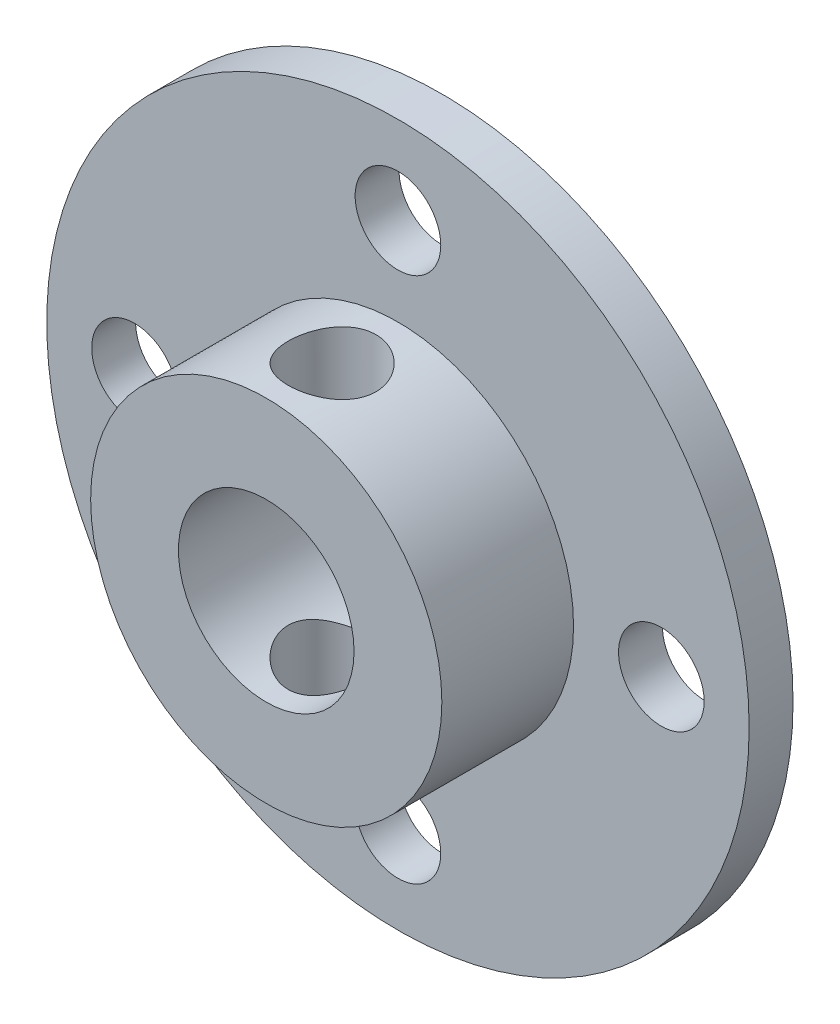
ISO-10303-21;
HEADER;
FILE_DESCRIPTION(('STEP AP214'),'2;1');
FILE_NAME('part.step','',(''),(''),'','','');
FILE_SCHEMA(('AUTOMOTIVE_DESIGN { 1 0 10303 214 1 1 1 1 }'));
ENDSEC;
DATA;
#1=APPLICATION_CONTEXT('core data for automotive mechanical design processes');
#2=APPLICATION_PROTOCOL_DEFINITION('international standard','automotive_design',2000,#1);
#3=PRODUCT_CONTEXT('',#1,'mechanical');
#4=PRODUCT('Part','Part','',(#3));
#5=PRODUCT_RELATED_PRODUCT_CATEGORY('part','',(#4));
#6=PRODUCT_DEFINITION_FORMATION('','',#4);
#7=PRODUCT_DEFINITION_CONTEXT('part definition',#1,'design');
#8=PRODUCT_DEFINITION('design','',#6,#7);
#9=PRODUCT_DEFINITION_SHAPE('','',#8);
#10=(LENGTH_UNIT() NAMED_UNIT(*) SI_UNIT(.MILLI.,.METRE.));
#11=(NAMED_UNIT(*) PLANE_ANGLE_UNIT() SI_UNIT($,.RADIAN.));
#12=(NAMED_UNIT(*) SI_UNIT($,.STERADIAN.) SOLID_ANGLE_UNIT());
#13=UNCERTAINTY_MEASURE_WITH_UNIT(LENGTH_MEASURE(1.E-05),#10,'distance_accuracy_value','');
#14=(GEOMETRIC_REPRESENTATION_CONTEXT(3) GLOBAL_UNCERTAINTY_ASSIGNED_CONTEXT((#13)) GLOBAL_UNIT_ASSIGNED_CONTEXT((#10,
#11,#12)) REPRESENTATION_CONTEXT('',''));
#15=CARTESIAN_POINT('',(0.,0.,0.));
#16=DIRECTION('',(0.,0.,1.));
#17=DIRECTION('',(1.,0.,0.));
#18=AXIS2_PLACEMENT_3D('',#15,#16,#17);
#19=CARTESIAN_POINT('',(0.,0.,8.));
#20=DIRECTION('',(0.,0.,1.));
#21=DIRECTION('',(1.,0.,0.));
#22=AXIS2_PLACEMENT_3D('',#19,#20,#21);
#23=PLANE('',#22);
#24=CARTESIAN_POINT('',(0.,0.,8.));
#25=DIRECTION('',(0.,0.,1.));
#26=DIRECTION('',(1.,0.,0.));
#27=AXIS2_PLACEMENT_3D('',#24,#25,#26);
#28=CIRCLE('',#27,8.);
#29=CARTESIAN_POINT('',(8.,0.,8.));
#30=VERTEX_POINT('',#29);
#31=EDGE_CURVE('E56',#30,#30,#28,.T.);
#32=ORIENTED_EDGE('',*,*,#31,.T.);
#33=EDGE_LOOP('',(#32));
#34=FACE_BOUND('',#33,.T.);
#35=CARTESIAN_POINT('',(0.,0.,8.));
#36=DIRECTION('',(0.,0.,1.));
#37=DIRECTION('',(1.,0.,0.));
#38=AXIS2_PLACEMENT_3D('',#35,#36,#37);
#39=CIRCLE('',#38,4.);
#40=CARTESIAN_POINT('',(4.,0.,8.));
#41=VERTEX_POINT('',#40);
#42=EDGE_CURVE('E62',#41,#41,#39,.T.);
#43=ORIENTED_EDGE('',*,*,#42,.F.);
#44=EDGE_LOOP('',(#43));
#45=FACE_BOUND('',#44,.T.);
#46=ADVANCED_FACE('F41',(#34,#45),#23,.T.);
#47=CARTESIAN_POINT('',(0.,0.,8.));
#48=DIRECTION('',(0.,0.,-1.));
#49=DIRECTION('',(-1.,0.,0.));
#50=AXIS2_PLACEMENT_3D('',#47,#48,#49);
#51=CYLINDRICAL_SURFACE('',#50,8.);
#52=CARTESIAN_POINT('',(0.,-8.,7.));
#53=CARTESIAN_POINT('',(0.110501451559642,-7.9999981315735,6.99999689901579));
#54=CARTESIAN_POINT('',(0.221037543774351,-7.99768770842435,6.99081126563495));
#55=CARTESIAN_POINT('',(0.438941765027377,-7.98869485106526,6.95436646492399));
#56=CARTESIAN_POINT('',(0.546308062494319,-7.98200993893301,6.92709705394953));
#57=CARTESIAN_POINT('',(0.754694496243435,-7.96500835109376,6.85541432871722));
#58=CARTESIAN_POINT('',(0.855722084573336,-7.95469603789411,6.81102160171297));
#59=CARTESIAN_POINT('',(1.04889617587257,-7.93153791743495,6.70642481327354));
#60=CARTESIAN_POINT('',(1.14104237913168,-7.91869202472209,6.64622021850804));
#61=CARTESIAN_POINT('',(1.31573590306789,-7.89156551455591,6.51039894712776));
#62=CARTESIAN_POINT('',(1.39807425341474,-7.87726276197502,6.43451790005459));
#63=CARTESIAN_POINT('',(1.54899856960443,-7.84898160157248,6.27006372678795));
#64=CARTESIAN_POINT('',(1.61758298259892,-7.83500323053157,6.18148916940409));
#65=CARTESIAN_POINT('',(1.74003539039863,-7.80873034264225,5.99253969768401));
#66=CARTESIAN_POINT('',(1.79366962123352,-7.79646392619748,5.89200902558836));
#67=CARTESIAN_POINT('',(1.88319587806766,-7.77532659757355,5.68300211778662));
#68=CARTESIAN_POINT('',(1.91909074058685,-7.76645514259224,5.57452715555731));
#69=CARTESIAN_POINT('',(1.97140644907302,-7.7533396892843,5.35500866906445));
#70=CARTESIAN_POINT('',(1.98820302444274,-7.74900654662681,5.24406013861601));
#71=CARTESIAN_POINT('',(2.00301570008855,-7.74519149946122,5.02084190800087));
#72=CARTESIAN_POINT('',(2.00103485575748,-7.74570880570571,4.90857242574382));
#73=CARTESIAN_POINT('',(1.97864869951961,-7.75145607355756,4.6887789230062));
#74=CARTESIAN_POINT('',(1.95869112025418,-7.75657150676391,4.58120583804623));
#75=CARTESIAN_POINT('',(1.90163224920399,-7.77075612894758,4.37098526545192));
#76=CARTESIAN_POINT('',(1.86452973609252,-7.77982559958985,4.26833812929477));
#77=CARTESIAN_POINT('',(1.77385263724958,-7.80100151874212,4.06968264499716));
#78=CARTESIAN_POINT('',(1.72011555631056,-7.81313769959755,3.97375177094724));
#79=CARTESIAN_POINT('',(1.59780836801993,-7.83906281127988,3.79210838699091));
#80=CARTESIAN_POINT('',(1.52923566507845,-7.85285203112837,3.70639766924367));
#81=CARTESIAN_POINT('',(1.37688456624163,-7.88101174053188,3.54506184574079));
#82=CARTESIAN_POINT('',(1.29272834422115,-7.89538759304001,3.46979401325153));
#83=CARTESIAN_POINT('',(1.11281589000493,-7.92274620771675,3.3343716767148));
#84=CARTESIAN_POINT('',(1.01705930361059,-7.93572892732543,3.27421763431525));
#85=CARTESIAN_POINT('',(0.816154518241856,-7.9589030945892,3.17059921836749));
#86=CARTESIAN_POINT('',(0.710975190944832,-7.96908480170303,3.12719287966076));
#87=CARTESIAN_POINT('',(0.494501344190511,-7.98543889321888,3.05877692572057));
#88=CARTESIAN_POINT('',(0.383207998867313,-7.99161204452374,3.03376379144248));
#89=CARTESIAN_POINT('',(0.160719960520037,-7.999139990285,3.00338991258822));
#90=CARTESIAN_POINT('',(0.0495956266509474,-8.00061404677705,2.9975426318996));
#91=CARTESIAN_POINT('',(-0.172043833068676,-7.99891739752601,3.00433200274065));
#92=CARTESIAN_POINT('',(-0.282559012859459,-7.99574710989128,3.01696699039884));
#93=CARTESIAN_POINT('',(-0.498152358368655,-7.98519441503143,3.05996121118851));
#94=CARTESIAN_POINT('',(-0.603286825291672,-7.97787512247748,3.09005501796932));
#95=CARTESIAN_POINT('',(-0.807009723270015,-7.95984942178845,3.16680944537126));
#96=CARTESIAN_POINT('',(-0.905597492043512,-7.94914267159856,3.21347173908423));
#97=CARTESIAN_POINT('',(-1.0953641792398,-7.92524410568414,3.3229815051663));
#98=CARTESIAN_POINT('',(-1.18638058911444,-7.91201156489243,3.38610148319568));
#99=CARTESIAN_POINT('',(-1.35670215152433,-7.88459345583226,3.52638654506263));
#100=CARTESIAN_POINT('',(-1.43600527863068,-7.87040772335606,3.60355405282254));
#101=CARTESIAN_POINT('',(-1.58265409076364,-7.84225275947695,3.77200261445929));
#102=CARTESIAN_POINT('',(-1.64965849016271,-7.82829738916375,3.86358360400323));
#103=CARTESIAN_POINT('',(-1.7673476786836,-7.80257171169652,4.05697684595429));
#104=CARTESIAN_POINT('',(-1.81803319221058,-7.79080130756035,4.15878864394634));
#105=CARTESIAN_POINT('',(-1.90126856081239,-7.77090792979554,4.36920762988411));
#106=CARTESIAN_POINT('',(-1.93392586220542,-7.76276340389207,4.47777017112535));
#107=CARTESIAN_POINT('',(-1.98046087993837,-7.75102325453578,4.69907951718548));
#108=CARTESIAN_POINT('',(-1.99434270330488,-7.74742663626581,4.81182540137665));
#109=CARTESIAN_POINT('',(-2.00271812044533,-7.74526534938609,5.03482803180694));
#110=CARTESIAN_POINT('',(-1.99775719704016,-7.74655910304352,5.14506324683297));
#111=CARTESIAN_POINT('',(-1.96983637108382,-7.7537054534379,5.36307185155731));
#112=CARTESIAN_POINT('',(-1.94687683024902,-7.75955795855809,5.47084529068487));
#113=CARTESIAN_POINT('',(-1.88390842592373,-7.77508347576963,5.68027794542054));
#114=CARTESIAN_POINT('',(-1.84400187290717,-7.78473353648412,5.78196974032028));
#115=CARTESIAN_POINT('',(-1.74835321814009,-7.80677007633105,5.97728717695158));
#116=CARTESIAN_POINT('',(-1.69260892004558,-7.81915693494364,6.07091169758255));
#117=CARTESIAN_POINT('',(-1.56515699818285,-7.8456751235135,6.25007283866936));
#118=CARTESIAN_POINT('',(-1.493070883883,-7.85984353109009,6.33533476456528));
#119=CARTESIAN_POINT('',(-1.33571916158631,-7.88810702995048,6.49272939306054));
#120=CARTESIAN_POINT('',(-1.25045042834819,-7.90220210302746,6.56485897348396));
#121=CARTESIAN_POINT('',(-1.06729011560345,-7.92903540863551,6.69521507808614));
#122=CARTESIAN_POINT('',(-0.969197896421847,-7.94174444487824,6.75316615156211));
#123=CARTESIAN_POINT('',(-0.764354746013967,-7.96406566633491,6.85166328392071));
#124=CARTESIAN_POINT('',(-0.657610084582319,-7.97368006933042,6.89222181419805));
#125=CARTESIAN_POINT('',(-0.459213670991296,-7.98730746087389,6.94876244043954));
#126=CARTESIAN_POINT('',(-0.368506894544092,-7.9920344673692,6.96793499073791));
#127=CARTESIAN_POINT('',(-0.185208095381711,-7.99838140309264,6.99355459149592));
#128=CARTESIAN_POINT('',(-0.092616214990155,-8.00000156601192,7.00000259907373));
#129=CARTESIAN_POINT('',(0.,-8.,7.));
#130=B_SPLINE_CURVE_WITH_KNOTS('',3,(#52,#53,#54,#55,#56,#57,#58,#59,#60,#61,#62,#63,#64,#65,
#66,#67,#68,#69,#70,#71,#72,#73,#74,#75,#76,#77,#78,#79,#80,#81,#82,#83,#84,#85,#86,#87,#88,#89,
#90,#91,#92,#93,#94,#95,#96,#97,#98,#99,#100,#101,#102,#103,#104,#105,#106,#107,#108,#109,#110,
#111,#112,#113,#114,#115,#116,#117,#118,#119,#120,#121,#122,#123,#124,#125,#126,#127,#128,#129),
.UNSPECIFIED.,.T.,.F.,(4,2,2,2,2,2,2,2,2,2,2,2,2,2,2,2,2,2,2,2,2,2,2,2,2,2,2,2,2,2,2,2,2,2,2,2,
2,2,4),(0.,0.331164949962519,0.662517650351865,0.99347320304814,1.32443992022577,
1.66152580582852,1.99864972773416,2.34078196727742,2.68285948225824,3.01808393468093,
3.3532538415469,3.68029996013785,4.00736937959145,4.337740371696,4.66816921119311,
5.00802001296453,5.34788119415424,5.6889097201658,6.02987298255951,6.36211078603462,
6.69431868154751,7.02160366023144,7.34892169767481,7.68204783424897,8.01523150681786,
8.35659345610396,8.69794025003772,9.03723006156476,9.37644564340971,9.70591707202578,
10.0353818794581,10.3628853408369,10.6904342418696,11.0265276855097,11.3627009303165,
11.7049624733721,12.0469781843289,12.3245632392729,12.6021274139515),.UNSPECIFIED.);
#131=CARTESIAN_POINT('',(0.,-8.,7.));
#132=VERTEX_POINT('',#131);
#133=EDGE_CURVE('E94',#132,#132,#130,.T.);
#134=ORIENTED_EDGE('',*,*,#133,.T.);
#135=EDGE_LOOP('',(#134));
#136=FACE_BOUND('',#135,.T.);
#137=CARTESIAN_POINT('',(0.,8.,7.));
#138=CARTESIAN_POINT('',(-0.110501451559641,7.9999981315735,6.99999689901579));
#139=CARTESIAN_POINT('',(-0.22103754377435,7.99768770842435,6.99081126563495));
#140=CARTESIAN_POINT('',(-0.438941765027376,7.98869485106526,6.95436646492399));
#141=CARTESIAN_POINT('',(-0.546308062494319,7.98200993893301,6.92709705394953));
#142=CARTESIAN_POINT('',(-0.754694496243435,7.96500835109376,6.85541432871722));
#143=CARTESIAN_POINT('',(-0.855722084573336,7.95469603789411,6.81102160171297));
#144=CARTESIAN_POINT('',(-1.04889617587257,7.93153791743495,6.70642481327354));
#145=CARTESIAN_POINT('',(-1.14104237913168,7.91869202472209,6.64622021850804));
#146=CARTESIAN_POINT('',(-1.31573590306789,7.89156551455591,6.51039894712776));
#147=CARTESIAN_POINT('',(-1.39807425341474,7.87726276197502,6.43451790005459));
#148=CARTESIAN_POINT('',(-1.54899856960443,7.84898160157248,6.27006372678795));
#149=CARTESIAN_POINT('',(-1.61758298259892,7.83500323053157,6.18148916940409));
#150=CARTESIAN_POINT('',(-1.74003539039863,7.80873034264225,5.99253969768401));
#151=CARTESIAN_POINT('',(-1.79366962123352,7.79646392619748,5.89200902558836));
#152=CARTESIAN_POINT('',(-1.88319587806766,7.77532659757355,5.68300211778662));
#153=CARTESIAN_POINT('',(-1.91909074058685,7.76645514259225,5.57452715555731));
#154=CARTESIAN_POINT('',(-1.97140644907302,7.7533396892843,5.35500866906445));
#155=CARTESIAN_POINT('',(-1.98820302444274,7.74900654662681,5.24406013861601));
#156=CARTESIAN_POINT('',(-2.00301570008854,7.74519149946122,5.02084190800087));
#157=CARTESIAN_POINT('',(-2.00103485575748,7.74570880570571,4.90857242574382));
#158=CARTESIAN_POINT('',(-1.97864869951961,7.75145607355756,4.6887789230062));
#159=CARTESIAN_POINT('',(-1.95869112025418,7.75657150676391,4.58120583804623));
#160=CARTESIAN_POINT('',(-1.90163224920399,7.77075612894758,4.37098526545192));
#161=CARTESIAN_POINT('',(-1.86452973609252,7.77982559958985,4.26833812929477));
#162=CARTESIAN_POINT('',(-1.77385263724958,7.80100151874212,4.06968264499716));
#163=CARTESIAN_POINT('',(-1.72011555631056,7.81313769959755,3.97375177094724));
#164=CARTESIAN_POINT('',(-1.59780836801993,7.83906281127988,3.79210838699091));
#165=CARTESIAN_POINT('',(-1.52923566507845,7.85285203112837,3.70639766924367));
#166=CARTESIAN_POINT('',(-1.37688456624163,7.88101174053188,3.54506184574079));
#167=CARTESIAN_POINT('',(-1.29272834422115,7.89538759304001,3.46979401325153));
#168=CARTESIAN_POINT('',(-1.11281589000493,7.92274620771675,3.3343716767148));
#169=CARTESIAN_POINT('',(-1.01705930361059,7.93572892732543,3.27421763431525));
#170=CARTESIAN_POINT('',(-0.816154518241856,7.9589030945892,3.17059921836749));
#171=CARTESIAN_POINT('',(-0.710975190944832,7.96908480170303,3.12719287966076));
#172=CARTESIAN_POINT('',(-0.494501344190511,7.98543889321888,3.05877692572057));
#173=CARTESIAN_POINT('',(-0.383207998867313,7.99161204452374,3.03376379144248));
#174=CARTESIAN_POINT('',(-0.160719960520036,7.999139990285,3.00338991258822));
#175=CARTESIAN_POINT('',(-0.0495956266509462,8.00061404677705,2.9975426318996));
#176=CARTESIAN_POINT('',(0.172043833068678,7.99891739752601,3.00433200274065));
#177=CARTESIAN_POINT('',(0.28255901285946,7.99574710989128,3.01696699039884));
#178=CARTESIAN_POINT('',(0.498152358368655,7.98519441503143,3.05996121118851));
#179=CARTESIAN_POINT('',(0.603286825291672,7.97787512247748,3.09005501796932));
#180=CARTESIAN_POINT('',(0.807009723270014,7.95984942178845,3.16680944537126));
#181=CARTESIAN_POINT('',(0.905597492043513,7.94914267159856,3.21347173908423));
#182=CARTESIAN_POINT('',(1.0953641792398,7.92524410568414,3.3229815051663));
#183=CARTESIAN_POINT('',(1.18638058911444,7.91201156489243,3.38610148319568));
#184=CARTESIAN_POINT('',(1.35670215152433,7.88459345583226,3.52638654506263));
#185=CARTESIAN_POINT('',(1.43600527863068,7.87040772335606,3.60355405282254));
#186=CARTESIAN_POINT('',(1.58265409076364,7.84225275947695,3.77200261445929));
#187=CARTESIAN_POINT('',(1.64965849016271,7.82829738916375,3.86358360400323));
#188=CARTESIAN_POINT('',(1.7673476786836,7.80257171169652,4.05697684595429));
#189=CARTESIAN_POINT('',(1.81803319221058,7.79080130756035,4.15878864394634));
#190=CARTESIAN_POINT('',(1.90126856081239,7.77090792979553,4.3692076298841));
#191=CARTESIAN_POINT('',(1.93392586220542,7.76276340389207,4.47777017112535));
#192=CARTESIAN_POINT('',(1.98046087993837,7.75102325453578,4.69907951718548));
#193=CARTESIAN_POINT('',(1.99434270330488,7.74742663626581,4.81182540137665));
#194=CARTESIAN_POINT('',(2.00271812044533,7.74526534938609,5.03482803180694));
#195=CARTESIAN_POINT('',(1.99775719704016,7.74655910304351,5.14506324683297));
#196=CARTESIAN_POINT('',(1.96983637108382,7.7537054534379,5.36307185155731));
#197=CARTESIAN_POINT('',(1.94687683024903,7.75955795855809,5.47084529068487));
#198=CARTESIAN_POINT('',(1.88390842592373,7.77508347576963,5.68027794542054));
#199=CARTESIAN_POINT('',(1.84400187290717,7.78473353648412,5.78196974032028));
#200=CARTESIAN_POINT('',(1.74835321814009,7.80677007633105,5.97728717695158));
#201=CARTESIAN_POINT('',(1.69260892004558,7.81915693494364,6.07091169758255));
#202=CARTESIAN_POINT('',(1.56515699818285,7.84567512351349,6.25007283866936));
#203=CARTESIAN_POINT('',(1.49307088388301,7.85984353109009,6.33533476456528));
#204=CARTESIAN_POINT('',(1.33571916158632,7.88810702995047,6.49272939306054));
#205=CARTESIAN_POINT('',(1.25045042834819,7.90220210302746,6.56485897348396));
#206=CARTESIAN_POINT('',(1.06729011560345,7.92903540863551,6.69521507808614));
#207=CARTESIAN_POINT('',(0.969197896421849,7.94174444487824,6.75316615156211));
#208=CARTESIAN_POINT('',(0.764354746013969,7.96406566633491,6.85166328392071));
#209=CARTESIAN_POINT('',(0.65761008458232,7.97368006933042,6.89222181419805));
#210=CARTESIAN_POINT('',(0.459213670991297,7.98730746087389,6.94876244043954));
#211=CARTESIAN_POINT('',(0.368506894544093,7.9920344673692,6.96793499073791));
#212=CARTESIAN_POINT('',(0.185208095381712,7.99838140309264,6.99355459149592));
#213=CARTESIAN_POINT('',(0.0926162149901558,8.00000156601192,7.00000259907373));
#214=CARTESIAN_POINT('',(0.,8.,7.));
#215=B_SPLINE_CURVE_WITH_KNOTS('',3,(#137,#138,#139,#140,#141,#142,#143,#144,#145,#146,#147,
#148,#149,#150,#151,#152,#153,#154,#155,#156,#157,#158,#159,#160,#161,#162,#163,#164,#165,#166,
#167,#168,#169,#170,#171,#172,#173,#174,#175,#176,#177,#178,#179,#180,#181,#182,#183,#184,#185,
#186,#187,#188,#189,#190,#191,#192,#193,#194,#195,#196,#197,#198,#199,#200,#201,#202,#203,#204,
#205,#206,#207,#208,#209,#210,#211,#212,#213,#214),.UNSPECIFIED.,.T.,.F.,(4,2,2,2,2,2,2,2,2,2,2,
2,2,2,2,2,2,2,2,2,2,2,2,2,2,2,2,2,2,2,2,2,2,2,2,2,2,2,4),(0.,0.331164949962519,
0.662517650351866,0.993473203048141,1.32443992022577,1.66152580582852,1.99864972773416,
2.34078196727742,2.68285948225824,3.01808393468093,3.3532538415469,3.68029996013785,
4.00736937959146,4.337740371696,4.66816921119311,5.00802001296453,5.34788119415424,
5.6889097201658,6.02987298255951,6.36211078603463,6.69431868154751,7.02160366023144,
7.34892169767481,7.68204783424897,8.01523150681786,8.35659345610395,8.69794025003772,
9.03723006156476,9.37644564340971,9.70591707202578,10.0353818794581,10.3628853408369,
10.6904342418696,11.0265276855097,11.3627009303165,11.7049624733721,12.0469781843289,
12.3245632392729,12.6021274139515),.UNSPECIFIED.);
#216=CARTESIAN_POINT('',(0.,8.,7.));
#217=VERTEX_POINT('',#216);
#218=EDGE_CURVE('E88',#217,#217,#215,.T.);
#219=ORIENTED_EDGE('',*,*,#218,.T.);
#220=EDGE_LOOP('',(#219));
#221=FACE_BOUND('',#220,.T.);
#222=CARTESIAN_POINT('',(0.,0.,2.));
#223=DIRECTION('',(0.,0.,1.));
#224=DIRECTION('',(1.,0.,0.));
#225=AXIS2_PLACEMENT_3D('',#222,#223,#224);
#226=CIRCLE('',#225,8.);
#227=CARTESIAN_POINT('',(8.,0.,2.));
#228=VERTEX_POINT('',#227);
#229=EDGE_CURVE('E138',#228,#228,#226,.T.);
#230=ORIENTED_EDGE('',*,*,#229,.T.);
#231=EDGE_LOOP('',(#230));
#232=FACE_BOUND('',#231,.T.);
#233=ORIENTED_EDGE('',*,*,#31,.F.);
#234=EDGE_LOOP('',(#233));
#235=FACE_BOUND('',#234,.T.);
#236=ADVANCED_FACE('F43',(#136,#221,#232,#235),#51,.T.);
#237=CARTESIAN_POINT('',(0.,0.,8.));
#238=DIRECTION('',(0.,0.,-1.));
#239=DIRECTION('',(-1.,0.,0.));
#240=AXIS2_PLACEMENT_3D('',#237,#238,#239);
#241=CYLINDRICAL_SURFACE('',#240,4.);
#242=CARTESIAN_POINT('',(0.,-4.,7.));
#243=CARTESIAN_POINT('',(0.105143925902467,-3.99999426810082,6.99999339536562));
#244=CARTESIAN_POINT('',(0.210413199395125,-3.99580982039513,6.99165985375789));
#245=CARTESIAN_POINT('',(0.417840470537792,-3.97948312074314,6.95869423931692));
#246=CARTESIAN_POINT('',(0.519992173427259,-3.96732575657839,6.93403121400437));
#247=CARTESIAN_POINT('',(0.717867089760898,-3.93632558806751,6.86961238276674));
#248=CARTESIAN_POINT('',(0.813613605878293,-3.91750878355075,6.82991523150406));
#249=CARTESIAN_POINT('',(0.996945233613197,-3.87491553031523,6.73685875727003));
#250=CARTESIAN_POINT('',(1.08453098798012,-3.85113947267051,6.68350051150227));
#251=CARTESIAN_POINT('',(1.25501563552382,-3.79912516516124,6.56096550102943));
#252=CARTESIAN_POINT('',(1.33731042224422,-3.77070398255074,6.49102704152072));
#253=CARTESIAN_POINT('',(1.48955888973396,-3.71319940493486,6.33895704150593));
#254=CARTESIAN_POINT('',(1.55950316621353,-3.68411552418069,6.25681629645512));
#255=CARTESIAN_POINT('',(1.69050400090056,-3.62597902394695,6.07503330095324));
#256=CARTESIAN_POINT('',(1.75045067110327,-3.59710373940264,5.97452780330818));
#257=CARTESIAN_POINT('',(1.85233645378139,-3.54571957544641,5.76326532802757));
#258=CARTESIAN_POINT('',(1.89428842993267,-3.52320615213979,5.6525157425545));
#259=CARTESIAN_POINT('',(1.95626488437718,-3.48915734075617,5.43066978915616));
#260=CARTESIAN_POINT('',(1.97745171416088,-3.47704543167427,5.31999109586521));
#261=CARTESIAN_POINT('',(2.00085398661769,-3.46363779897055,5.09604232444105));
#262=CARTESIAN_POINT('',(2.00308817674615,-3.46233138686576,4.98277491825769));
#263=CARTESIAN_POINT('',(1.98937457434459,-3.47021860514497,4.77142795136926));
#264=CARTESIAN_POINT('',(1.97556911907364,-3.47817527324027,4.6731519375539));
#265=CARTESIAN_POINT('',(1.93387969811387,-3.501524574677,4.48055618125392));
#266=CARTESIAN_POINT('',(1.9059912477953,-3.51691957663552,4.38623770938937));
#267=CARTESIAN_POINT('',(1.83641956077201,-3.55374952825482,4.20154173486868));
#268=CARTESIAN_POINT('',(1.79443013423199,-3.57531681327997,4.11130720242842));
#269=CARTESIAN_POINT('',(1.69808337533601,-3.62206808562807,3.93873141481998));
#270=CARTESIAN_POINT('',(1.64372048762494,-3.64725369560381,3.85639372879982));
#271=CARTESIAN_POINT('',(1.51613210982558,-3.70226315806572,3.69095749451355));
#272=CARTESIAN_POINT('',(1.44138891673856,-3.73227020473492,3.60908625284769));
#273=CARTESIAN_POINT('',(1.27911115748275,-3.79095246600814,3.4585291628182));
#274=CARTESIAN_POINT('',(1.19157051314857,-3.81962703917602,3.38984961593223));
#275=CARTESIAN_POINT('',(1.0010330116637,-3.87403974565928,3.26462867794055));
#276=CARTESIAN_POINT('',(0.897507183198818,-3.89957968324014,3.20879905510852));
#277=CARTESIAN_POINT('',(0.680932430977593,-3.94315762242485,3.11580594191398));
#278=CARTESIAN_POINT('',(0.567891152530552,-3.96120157887106,3.07862762996967));
#279=CARTESIAN_POINT('',(0.345532983321405,-3.98648667482871,3.02704919256665));
#280=CARTESIAN_POINT('',(0.236683061096653,-3.9944987660262,3.01101752850644));
#281=CARTESIAN_POINT('',(0.0175591998987035,-4.00146026918207,2.99707053773103));
#282=CARTESIAN_POINT('',(-0.0927140397398171,-4.00041397442637,2.99914662872106));
#283=CARTESIAN_POINT('',(-0.302465943971973,-3.9898238450687,3.02041337683749));
#284=CARTESIAN_POINT('',(-0.40211881609986,-3.98094491376337,3.03826506545999));
#285=CARTESIAN_POINT('',(-0.596813784603882,-3.95644342629681,3.08847614379024));
#286=CARTESIAN_POINT('',(-0.691855371382173,-3.94082012668824,3.12083713290699));
#287=CARTESIAN_POINT('',(-0.877777216899145,-3.90368502827176,3.19999693286607));
#288=CARTESIAN_POINT('',(-0.968460794011607,-3.88201763539262,3.24718210023257));
#289=CARTESIAN_POINT('',(-1.14092272339854,-3.83487948634835,3.35421507129314));
#290=CARTESIAN_POINT('',(-1.22269725955318,-3.80940711133877,3.41406826919079));
#291=CARTESIAN_POINT('',(-1.38353537857843,-3.75416442672396,3.55152085066143));
#292=CARTESIAN_POINT('',(-1.46154415563805,-3.72421769686998,3.63028573689029));
#293=CARTESIAN_POINT('',(-1.60371264223771,-3.6652478321764,3.79985030255546));
#294=CARTESIAN_POINT('',(-1.66786277142375,-3.63622534800094,3.89065823769584));
#295=CARTESIAN_POINT('',(-1.78341582895803,-3.58102384412979,4.08728730834595));
#296=CARTESIAN_POINT('',(-1.8340509916005,-3.55505059178121,4.19362253218896));
#297=CARTESIAN_POINT('',(-1.91616565186941,-3.51148144588269,4.41502013514993));
#298=CARTESIAN_POINT('',(-1.94766983173403,-3.493874764435,4.53007105293378));
#299=CARTESIAN_POINT('',(-1.98772337493374,-3.47123002051604,4.75382044576941));
#300=CARTESIAN_POINT('',(-1.9981859928109,-3.4651476693013,4.86206850687048));
#301=CARTESIAN_POINT('',(-2.0013783087524,-3.46330709283207,5.07889413432905));
#302=CARTESIAN_POINT('',(-1.99411569324648,-3.4675443925278,5.18747153747572));
#303=CARTESIAN_POINT('',(-1.96385225118662,-3.48475724102153,5.39096700306687));
#304=CARTESIAN_POINT('',(-1.94241662868607,-3.49686188965317,5.48620094028948));
#305=CARTESIAN_POINT('',(-1.88635071644882,-3.52742032375305,5.67161623884873));
#306=CARTESIAN_POINT('',(-1.85171618231984,-3.54587615139337,5.76179596418406));
#307=CARTESIAN_POINT('',(-1.76763149060113,-3.58857060729071,5.94124970197307));
#308=CARTESIAN_POINT('',(-1.7173422756314,-3.61311444791841,6.03005580365806));
#309=CARTESIAN_POINT('',(-1.60430194327478,-3.66470663269721,6.19854907236252));
#310=CARTESIAN_POINT('',(-1.54154434248312,-3.69175627591221,6.27823146104222));
#311=CARTESIAN_POINT('',(-1.39640665332275,-3.74924646316184,6.43628396470935));
#312=CARTESIAN_POINT('',(-1.31256884599452,-3.77969966613256,6.51331820470058));
#313=CARTESIAN_POINT('',(-1.13230961246639,-3.83755504519861,6.65252596687054));
#314=CARTESIAN_POINT('',(-1.03588144661039,-3.8649555725239,6.71469147893981));
#315=CARTESIAN_POINT('',(-0.83186319356589,-3.91396019133075,6.82247272542414));
#316=CARTESIAN_POINT('',(-0.72419900755346,-3.93552192987866,6.86796833847294));
#317=CARTESIAN_POINT('',(-0.501484202276173,-3.97002682597974,6.93961633551482));
#318=CARTESIAN_POINT('',(-0.3864555991782,-3.98299446726136,6.96582369361143));
#319=CARTESIAN_POINT('',(-0.22520389298179,-3.99390923826956,6.98779482217148));
#320=CARTESIAN_POINT('',(-0.180323758883129,-3.99618730680502,6.99236528173268));
#321=CARTESIAN_POINT('',(-0.0903034636101828,-3.99923393953631,6.99846933102817));
#322=CARTESIAN_POINT('',(-0.0451632952932565,-4.00000246206762,7.00000283694042));
#323=CARTESIAN_POINT('',(0.,-4.,7.));
#324=B_SPLINE_CURVE_WITH_KNOTS('',3,(#242,#243,#244,#245,#246,#247,#248,#249,#250,#251,#252,
#253,#254,#255,#256,#257,#258,#259,#260,#261,#262,#263,#264,#265,#266,#267,#268,#269,#270,#271,
#272,#273,#274,#275,#276,#277,#278,#279,#280,#281,#282,#283,#284,#285,#286,#287,#288,#289,#290,
#291,#292,#293,#294,#295,#296,#297,#298,#299,#300,#301,#302,#303,#304,#305,#306,#307,#308,#309,
#310,#311,#312,#313,#314,#315,#316,#317,#318,#319,#320,#321,#322,#323),.UNSPECIFIED.,.T.,.F.,(4,
2,2,2,2,2,2,2,2,2,2,2,2,2,2,2,2,2,2,2,2,2,2,2,2,2,2,2,2,2,2,2,2,2,2,2,2,2,2,2,4),(0.,
0.315248514840585,0.631096299418395,0.945724310984596,1.26032752116313,1.59396351743618,
1.92785247530807,2.28763452861505,2.64715895796562,2.98516024280459,3.32282714658041,
3.62011424818641,3.91749607851357,4.22180480336975,4.52625042520444,4.86929882667757,
5.21251069197373,5.57166044428881,5.93052433824559,6.25966580942691,6.58865129022952,
6.89213813012244,7.19565843261863,7.50785712055797,7.82018901496678,8.16319221288838,
8.50643177230864,8.86629364323452,9.22569023890902,9.55058615006093,9.87534119729357,
10.1691586049771,10.463070575767,10.7767291356057,11.0905512228726,11.4425048551434,
11.7946476676249,12.1492802732705,12.502898172423,12.6383056026783,12.7737167702213),.UNSPECIFIED.);
#325=CARTESIAN_POINT('',(0.,-4.,7.));
#326=VERTEX_POINT('',#325);
#327=EDGE_CURVE('E46',#326,#326,#324,.T.);
#328=ORIENTED_EDGE('',*,*,#327,.F.);
#329=EDGE_LOOP('',(#328));
#330=FACE_BOUND('',#329,.T.);
#331=CARTESIAN_POINT('',(0.,4.,7.));
#332=CARTESIAN_POINT('',(-0.105143925902467,3.99999426810082,6.99999339536562));
#333=CARTESIAN_POINT('',(-0.210413199395125,3.99580982039513,6.99165985375789));
#334=CARTESIAN_POINT('',(-0.417840470537792,3.97948312074314,6.95869423931692));
#335=CARTESIAN_POINT('',(-0.519992173427259,3.96732575657839,6.93403121400437));
#336=CARTESIAN_POINT('',(-0.717867089760897,3.93632558806751,6.86961238276674));
#337=CARTESIAN_POINT('',(-0.813613605878292,3.91750878355075,6.82991523150406));
#338=CARTESIAN_POINT('',(-0.996945233613197,3.87491553031523,6.73685875727003));
#339=CARTESIAN_POINT('',(-1.08453098798012,3.8511394726705,6.68350051150227));
#340=CARTESIAN_POINT('',(-1.25501563552382,3.79912516516124,6.56096550102943));
#341=CARTESIAN_POINT('',(-1.33731042224422,3.77070398255074,6.49102704152072));
#342=CARTESIAN_POINT('',(-1.48955888973396,3.71319940493486,6.33895704150593));
#343=CARTESIAN_POINT('',(-1.55950316621353,3.68411552418069,6.25681629645512));
#344=CARTESIAN_POINT('',(-1.69050400090056,3.62597902394695,6.07503330095324));
#345=CARTESIAN_POINT('',(-1.75045067110327,3.59710373940264,5.97452780330817));
#346=CARTESIAN_POINT('',(-1.85233645378139,3.54571957544641,5.76326532802757));
#347=CARTESIAN_POINT('',(-1.89428842993267,3.52320615213979,5.6525157425545));
#348=CARTESIAN_POINT('',(-1.95626488437718,3.48915734075617,5.43066978915615));
#349=CARTESIAN_POINT('',(-1.97745171416088,3.47704543167427,5.31999109586521));
#350=CARTESIAN_POINT('',(-2.00085398661769,3.46363779897055,5.09604232444105));
#351=CARTESIAN_POINT('',(-2.00308817674615,3.46233138686576,4.98277491825769));
#352=CARTESIAN_POINT('',(-1.98937457434459,3.47021860514497,4.77142795136926));
#353=CARTESIAN_POINT('',(-1.97556911907364,3.47817527324027,4.6731519375539));
#354=CARTESIAN_POINT('',(-1.93387969811386,3.50152457467701,4.48055618125392));
#355=CARTESIAN_POINT('',(-1.9059912477953,3.51691957663553,4.38623770938937));
#356=CARTESIAN_POINT('',(-1.83641956077201,3.55374952825482,4.20154173486868));
#357=CARTESIAN_POINT('',(-1.79443013423199,3.57531681327997,4.11130720242842));
#358=CARTESIAN_POINT('',(-1.698083375336,3.62206808562807,3.93873141481998));
#359=CARTESIAN_POINT('',(-1.64372048762493,3.64725369560381,3.85639372879982));
#360=CARTESIAN_POINT('',(-1.51613210982558,3.70226315806572,3.69095749451355));
#361=CARTESIAN_POINT('',(-1.44138891673856,3.73227020473492,3.60908625284769));
#362=CARTESIAN_POINT('',(-1.27911115748275,3.79095246600814,3.4585291628182));
#363=CARTESIAN_POINT('',(-1.19157051314857,3.81962703917602,3.38984961593223));
#364=CARTESIAN_POINT('',(-1.0010330116637,3.87403974565928,3.26462867794055));
#365=CARTESIAN_POINT('',(-0.897507183198817,3.89957968324015,3.20879905510852));
#366=CARTESIAN_POINT('',(-0.680932430977593,3.94315762242485,3.11580594191398));
#367=CARTESIAN_POINT('',(-0.567891152530551,3.96120157887106,3.07862762996967));
#368=CARTESIAN_POINT('',(-0.345532983321404,3.98648667482871,3.02704919256665));
#369=CARTESIAN_POINT('',(-0.236683061096652,3.9944987660262,3.01101752850644));
#370=CARTESIAN_POINT('',(-0.017559199898703,4.00146026918207,2.99707053773103));
#371=CARTESIAN_POINT('',(0.0927140397398178,4.00041397442637,2.99914662872106));
#372=CARTESIAN_POINT('',(0.302465943971974,3.9898238450687,3.02041337683749));
#373=CARTESIAN_POINT('',(0.402118816099861,3.98094491376337,3.03826506545999));
#374=CARTESIAN_POINT('',(0.596813784603883,3.9564434262968,3.08847614379024));
#375=CARTESIAN_POINT('',(0.691855371382174,3.94082012668824,3.12083713290699));
#376=CARTESIAN_POINT('',(0.877777216899146,3.90368502827176,3.19999693286607));
#377=CARTESIAN_POINT('',(0.968460794011607,3.88201763539261,3.24718210023257));
#378=CARTESIAN_POINT('',(1.14092272339854,3.83487948634835,3.35421507129314));
#379=CARTESIAN_POINT('',(1.22269725955318,3.80940711133877,3.41406826919079));
#380=CARTESIAN_POINT('',(1.38353537857843,3.75416442672396,3.55152085066143));
#381=CARTESIAN_POINT('',(1.46154415563805,3.72421769686998,3.63028573689029));
#382=CARTESIAN_POINT('',(1.60371264223771,3.6652478321764,3.79985030255546));
#383=CARTESIAN_POINT('',(1.66786277142375,3.63622534800094,3.89065823769584));
#384=CARTESIAN_POINT('',(1.78341582895804,3.58102384412979,4.08728730834595));
#385=CARTESIAN_POINT('',(1.8340509916005,3.55505059178121,4.19362253218896));
#386=CARTESIAN_POINT('',(1.91616565186941,3.51148144588269,4.41502013514993));
#387=CARTESIAN_POINT('',(1.94766983173403,3.493874764435,4.53007105293378));
#388=CARTESIAN_POINT('',(1.98772337493375,3.47123002051604,4.75382044576941));
#389=CARTESIAN_POINT('',(1.9981859928109,3.4651476693013,4.86206850687048));
#390=CARTESIAN_POINT('',(2.0013783087524,3.46330709283206,5.07889413432905));
#391=CARTESIAN_POINT('',(1.99411569324648,3.4675443925278,5.18747153747572));
#392=CARTESIAN_POINT('',(1.96385225118662,3.48475724102153,5.39096700306687));
#393=CARTESIAN_POINT('',(1.94241662868607,3.49686188965317,5.48620094028948));
#394=CARTESIAN_POINT('',(1.88635071644882,3.52742032375305,5.67161623884873));
#395=CARTESIAN_POINT('',(1.85171618231984,3.54587615139337,5.76179596418406));
#396=CARTESIAN_POINT('',(1.76763149060113,3.58857060729071,5.94124970197307));
#397=CARTESIAN_POINT('',(1.7173422756314,3.61311444791841,6.03005580365806));
#398=CARTESIAN_POINT('',(1.60430194327479,3.66470663269721,6.19854907236252));
#399=CARTESIAN_POINT('',(1.54154434248312,3.69175627591221,6.27823146104222));
#400=CARTESIAN_POINT('',(1.39640665332275,3.74924646316184,6.43628396470935));
#401=CARTESIAN_POINT('',(1.31256884599452,3.77969966613256,6.51331820470058));
#402=CARTESIAN_POINT('',(1.13230961246639,3.83755504519861,6.65252596687054));
#403=CARTESIAN_POINT('',(1.03588144661039,3.8649555725239,6.71469147893981));
#404=CARTESIAN_POINT('',(0.831863193565891,3.91396019133075,6.82247272542414));
#405=CARTESIAN_POINT('',(0.724199007553461,3.93552192987866,6.86796833847294));
#406=CARTESIAN_POINT('',(0.501484202276173,3.97002682597974,6.93961633551482));
#407=CARTESIAN_POINT('',(0.3864555991782,3.98299446726136,6.96582369361143));
#408=CARTESIAN_POINT('',(0.225203892981789,3.99390923826956,6.98779482217148));
#409=CARTESIAN_POINT('',(0.180323758883129,3.99618730680502,6.99236528173268));
#410=CARTESIAN_POINT('',(0.0903034636101825,3.99923393953631,6.99846933102817));
#411=CARTESIAN_POINT('',(0.0451632952932567,4.00000246206762,7.00000283694042));
#412=CARTESIAN_POINT('',(0.,4.,7.));
#413=B_SPLINE_CURVE_WITH_KNOTS('',3,(#331,#332,#333,#334,#335,#336,#337,#338,#339,#340,#341,
#342,#343,#344,#345,#346,#347,#348,#349,#350,#351,#352,#353,#354,#355,#356,#357,#358,#359,#360,
#361,#362,#363,#364,#365,#366,#367,#368,#369,#370,#371,#372,#373,#374,#375,#376,#377,#378,#379,
#380,#381,#382,#383,#384,#385,#386,#387,#388,#389,#390,#391,#392,#393,#394,#395,#396,#397,#398,
#399,#400,#401,#402,#403,#404,#405,#406,#407,#408,#409,#410,#411,#412),.UNSPECIFIED.,.T.,.F.,(4,
2,2,2,2,2,2,2,2,2,2,2,2,2,2,2,2,2,2,2,2,2,2,2,2,2,2,2,2,2,2,2,2,2,2,2,2,2,2,2,4),(0.,
0.315248514840585,0.631096299418396,0.945724310984597,1.26032752116314,1.59396351743618,
1.92785247530807,2.28763452861506,2.64715895796562,2.98516024280459,3.32282714658041,
3.62011424818641,3.91749607851357,4.22180480336975,4.52625042520444,4.86929882667757,
5.21251069197373,5.57166044428881,5.93052433824559,6.25966580942691,6.58865129022952,
6.89213813012244,7.19565843261863,7.50785712055797,7.82018901496679,8.16319221288838,
8.50643177230864,8.86629364323452,9.22569023890902,9.55058615006093,9.87534119729357,
10.1691586049771,10.463070575767,10.7767291356057,11.0905512228726,11.4425048551434,
11.7946476676249,12.1492802732705,12.502898172423,12.6383056026783,12.7737167702213),.UNSPECIFIED.);
#414=CARTESIAN_POINT('',(0.,4.,7.));
#415=VERTEX_POINT('',#414);
#416=EDGE_CURVE('E65',#415,#415,#413,.T.);
#417=ORIENTED_EDGE('',*,*,#416,.F.);
#418=EDGE_LOOP('',(#417));
#419=FACE_BOUND('',#418,.T.);
#420=CARTESIAN_POINT('',(0.,0.,2.));
#421=DIRECTION('',(0.,0.,1.));
#422=DIRECTION('',(1.,0.,0.));
#423=AXIS2_PLACEMENT_3D('',#420,#421,#422);
#424=CIRCLE('',#423,4.);
#425=CARTESIAN_POINT('',(4.,0.,2.));
#426=VERTEX_POINT('',#425);
#427=EDGE_CURVE('E10',#426,#426,#424,.T.);
#428=ORIENTED_EDGE('',*,*,#427,.F.);
#429=EDGE_LOOP('',(#428));
#430=FACE_BOUND('',#429,.T.);
#431=ORIENTED_EDGE('',*,*,#42,.T.);
#432=EDGE_LOOP('',(#431));
#433=FACE_BOUND('',#432,.T.);
#434=ADVANCED_FACE('F71',(#330,#419,#430,#433),#241,.F.);
#435=CARTESIAN_POINT('',(0.,0.,2.));
#436=DIRECTION('',(0.,0.,1.));
#437=DIRECTION('',(1.,0.,0.));
#438=AXIS2_PLACEMENT_3D('',#435,#436,#437);
#439=PLANE('',#438);
#440=ORIENTED_EDGE('',*,*,#427,.T.);
#441=EDGE_LOOP('',(#440));
#442=FACE_BOUND('',#441,.T.);
#443=ADVANCED_FACE('F192',(#442),#439,.T.);
#444=ORIENTED_EDGE('',*,*,#229,.F.);
#445=EDGE_LOOP('',(#444));
#446=FACE_BOUND('',#445,.T.);
#447=CARTESIAN_POINT('',(-12.,0.,2.));
#448=DIRECTION('',(0.,0.,1.));
#449=DIRECTION('',(1.,0.,0.));
#450=AXIS2_PLACEMENT_3D('',#447,#448,#449);
#451=CIRCLE('',#450,1.95);
#452=CARTESIAN_POINT('',(-10.05,0.,2.));
#453=VERTEX_POINT('',#452);
#454=EDGE_CURVE('E110',#453,#453,#451,.T.);
#455=ORIENTED_EDGE('',*,*,#454,.F.);
#456=EDGE_LOOP('',(#455));
#457=FACE_BOUND('',#456,.T.);
#458=CARTESIAN_POINT('',(12.,0.,2.));
#459=DIRECTION('',(0.,0.,1.));
#460=DIRECTION('',(1.,0.,0.));
#461=AXIS2_PLACEMENT_3D('',#458,#459,#460);
#462=CIRCLE('',#461,1.95);
#463=CARTESIAN_POINT('',(13.95,0.,2.));
#464=VERTEX_POINT('',#463);
#465=EDGE_CURVE('E126',#464,#464,#462,.T.);
#466=ORIENTED_EDGE('',*,*,#465,.F.);
#467=EDGE_LOOP('',(#466));
#468=FACE_BOUND('',#467,.T.);
#469=CARTESIAN_POINT('',(0.,0.,2.));
#470=DIRECTION('',(0.,0.,1.));
#471=DIRECTION('',(1.,0.,0.));
#472=AXIS2_PLACEMENT_3D('',#469,#470,#471);
#473=CIRCLE('',#472,16.);
#474=CARTESIAN_POINT('',(16.,0.,2.));
#475=VERTEX_POINT('',#474);
#476=EDGE_CURVE('E134',#475,#475,#473,.T.);
#477=ORIENTED_EDGE('',*,*,#476,.T.);
#478=EDGE_LOOP('',(#477));
#479=FACE_BOUND('',#478,.T.);
#480=CARTESIAN_POINT('',(0.,-12.,2.));
#481=DIRECTION('',(0.,0.,1.));
#482=DIRECTION('',(1.,0.,0.));
#483=AXIS2_PLACEMENT_3D('',#480,#481,#482);
#484=CIRCLE('',#483,1.95);
#485=CARTESIAN_POINT('',(1.95,-12.,2.));
#486=VERTEX_POINT('',#485);
#487=EDGE_CURVE('E118',#486,#486,#484,.T.);
#488=ORIENTED_EDGE('',*,*,#487,.F.);
#489=EDGE_LOOP('',(#488));
#490=FACE_BOUND('',#489,.T.);
#491=CARTESIAN_POINT('',(0.,12.,2.));
#492=DIRECTION('',(0.,0.,1.));
#493=DIRECTION('',(1.,0.,0.));
#494=AXIS2_PLACEMENT_3D('',#491,#492,#493);
#495=CIRCLE('',#494,1.95);
#496=CARTESIAN_POINT('',(1.95,12.,2.));
#497=VERTEX_POINT('',#496);
#498=EDGE_CURVE('E102',#497,#497,#495,.T.);
#499=ORIENTED_EDGE('',*,*,#498,.F.);
#500=EDGE_LOOP('',(#499));
#501=FACE_BOUND('',#500,.T.);
#502=ADVANCED_FACE('F190',(#446,#457,#468,#479,#490,#501),#439,.T.);
#503=CARTESIAN_POINT('',(0.,0.,2.));
#504=DIRECTION('',(0.,0.,-1.));
#505=DIRECTION('',(-1.,0.,0.));
#506=AXIS2_PLACEMENT_3D('',#503,#504,#505);
#507=CYLINDRICAL_SURFACE('',#506,16.);
#508=ORIENTED_EDGE('',*,*,#476,.F.);
#509=EDGE_LOOP('',(#508));
#510=FACE_BOUND('',#509,.T.);
#511=CARTESIAN_POINT('',(0.,0.,0.));
#512=DIRECTION('',(0.,0.,1.));
#513=DIRECTION('',(1.,0.,0.));
#514=AXIS2_PLACEMENT_3D('',#511,#512,#513);
#515=CIRCLE('',#514,16.);
#516=CARTESIAN_POINT('',(16.,0.,0.));
#517=VERTEX_POINT('',#516);
#518=EDGE_CURVE('E130',#517,#517,#515,.T.);
#519=ORIENTED_EDGE('',*,*,#518,.T.);
#520=EDGE_LOOP('',(#519));
#521=FACE_BOUND('',#520,.T.);
#522=ADVANCED_FACE('F188',(#510,#521),#507,.T.);
#523=CARTESIAN_POINT('',(12.,0.,2.));
#524=DIRECTION('',(0.,0.,-1.));
#525=DIRECTION('',(-1.,0.,0.));
#526=AXIS2_PLACEMENT_3D('',#523,#524,#525);
#527=CYLINDRICAL_SURFACE('',#526,1.95);
#528=ORIENTED_EDGE('',*,*,#465,.T.);
#529=EDGE_LOOP('',(#528));
#530=FACE_BOUND('',#529,.T.);
#531=CARTESIAN_POINT('',(12.,0.,0.));
#532=DIRECTION('',(0.,0.,1.));
#533=DIRECTION('',(1.,0.,0.));
#534=AXIS2_PLACEMENT_3D('',#531,#532,#533);
#535=CIRCLE('',#534,1.95);
#536=CARTESIAN_POINT('',(13.95,0.,0.));
#537=VERTEX_POINT('',#536);
#538=EDGE_CURVE('E122',#537,#537,#535,.T.);
#539=ORIENTED_EDGE('',*,*,#538,.F.);
#540=EDGE_LOOP('',(#539));
#541=FACE_BOUND('',#540,.T.);
#542=ADVANCED_FACE('F182',(#530,#541),#527,.F.);
#543=CARTESIAN_POINT('',(0.,-12.,2.));
#544=DIRECTION('',(0.,0.,-1.));
#545=DIRECTION('',(-1.,0.,0.));
#546=AXIS2_PLACEMENT_3D('',#543,#544,#545);
#547=CYLINDRICAL_SURFACE('',#546,1.95);
#548=ORIENTED_EDGE('',*,*,#487,.T.);
#549=EDGE_LOOP('',(#548));
#550=FACE_BOUND('',#549,.T.);
#551=CARTESIAN_POINT('',(0.,-12.,0.));
#552=DIRECTION('',(0.,0.,1.));
#553=DIRECTION('',(1.,0.,0.));
#554=AXIS2_PLACEMENT_3D('',#551,#552,#553);
#555=CIRCLE('',#554,1.95);
#556=CARTESIAN_POINT('',(1.95,-12.,0.));
#557=VERTEX_POINT('',#556);
#558=EDGE_CURVE('E114',#557,#557,#555,.T.);
#559=ORIENTED_EDGE('',*,*,#558,.F.);
#560=EDGE_LOOP('',(#559));
#561=FACE_BOUND('',#560,.T.);
#562=ADVANCED_FACE('F177',(#550,#561),#547,.F.);
#563=CARTESIAN_POINT('',(-12.,0.,2.));
#564=DIRECTION('',(0.,0.,-1.));
#565=DIRECTION('',(-1.,0.,0.));
#566=AXIS2_PLACEMENT_3D('',#563,#564,#565);
#567=CYLINDRICAL_SURFACE('',#566,1.95);
#568=ORIENTED_EDGE('',*,*,#454,.T.);
#569=EDGE_LOOP('',(#568));
#570=FACE_BOUND('',#569,.T.);
#571=CARTESIAN_POINT('',(-12.,0.,0.));
#572=DIRECTION('',(0.,0.,1.));
#573=DIRECTION('',(1.,0.,0.));
#574=AXIS2_PLACEMENT_3D('',#571,#572,#573);
#575=CIRCLE('',#574,1.95);
#576=CARTESIAN_POINT('',(-10.05,0.,0.));
#577=VERTEX_POINT('',#576);
#578=EDGE_CURVE('E106',#577,#577,#575,.T.);
#579=ORIENTED_EDGE('',*,*,#578,.F.);
#580=EDGE_LOOP('',(#579));
#581=FACE_BOUND('',#580,.T.);
#582=ADVANCED_FACE('F163',(#570,#581),#567,.F.);
#583=CARTESIAN_POINT('',(0.,12.,2.));
#584=DIRECTION('',(0.,0.,-1.));
#585=DIRECTION('',(-1.,0.,0.));
#586=AXIS2_PLACEMENT_3D('',#583,#584,#585);
#587=CYLINDRICAL_SURFACE('',#586,1.95);
#588=ORIENTED_EDGE('',*,*,#498,.T.);
#589=EDGE_LOOP('',(#588));
#590=FACE_BOUND('',#589,.T.);
#591=CARTESIAN_POINT('',(0.,12.,0.));
#592=DIRECTION('',(0.,0.,1.));
#593=DIRECTION('',(1.,0.,0.));
#594=AXIS2_PLACEMENT_3D('',#591,#592,#593);
#595=CIRCLE('',#594,1.95);
#596=CARTESIAN_POINT('',(1.95,12.,0.));
#597=VERTEX_POINT('',#596);
#598=EDGE_CURVE('E101',#597,#597,#595,.T.);
#599=ORIENTED_EDGE('',*,*,#598,.F.);
#600=EDGE_LOOP('',(#599));
#601=FACE_BOUND('',#600,.T.);
#602=ADVANCED_FACE('F81',(#590,#601),#587,.F.);
#603=CARTESIAN_POINT('',(0.,0.,0.));
#604=DIRECTION('',(0.,0.,1.));
#605=DIRECTION('',(1.,0.,0.));
#606=AXIS2_PLACEMENT_3D('',#603,#604,#605);
#607=PLANE('',#606);
#608=ORIENTED_EDGE('',*,*,#518,.F.);
#609=EDGE_LOOP('',(#608));
#610=FACE_BOUND('',#609,.T.);
#611=ORIENTED_EDGE('',*,*,#538,.T.);
#612=EDGE_LOOP('',(#611));
#613=FACE_BOUND('',#612,.T.);
#614=ORIENTED_EDGE('',*,*,#558,.T.);
#615=EDGE_LOOP('',(#614));
#616=FACE_BOUND('',#615,.T.);
#617=ORIENTED_EDGE('',*,*,#578,.T.);
#618=EDGE_LOOP('',(#617));
#619=FACE_BOUND('',#618,.T.);
#620=ORIENTED_EDGE('',*,*,#598,.T.);
#621=EDGE_LOOP('',(#620));
#622=FACE_BOUND('',#621,.T.);
#623=ADVANCED_FACE('F155',(#610,#613,#616,#619,#622),#607,.F.);
#624=CARTESIAN_POINT('',(0.,-10.,5.));
#625=DIRECTION('',(0.,1.,0.));
#626=DIRECTION('',(0.,0.,1.));
#627=AXIS2_PLACEMENT_3D('',#624,#625,#626);
#628=CYLINDRICAL_SURFACE('',#627,2.);
#629=ORIENTED_EDGE('',*,*,#416,.T.);
#630=EDGE_LOOP('',(#629));
#631=FACE_BOUND('',#630,.T.);
#632=ORIENTED_EDGE('',*,*,#218,.F.);
#633=EDGE_LOOP('',(#632));
#634=FACE_BOUND('',#633,.T.);
#635=ADVANCED_FACE('F79',(#631,#634),#628,.F.);
#636=ORIENTED_EDGE('',*,*,#327,.T.);
#637=EDGE_LOOP('',(#636));
#638=FACE_BOUND('',#637,.T.);
#639=ORIENTED_EDGE('',*,*,#133,.F.);
#640=EDGE_LOOP('',(#639));
#641=FACE_BOUND('',#640,.T.);
#642=ADVANCED_FACE('F75',(#638,#641),#628,.F.);
#643=CLOSED_SHELL('',(#46,#236,#434,#443,#502,#522,#542,#562,#582,#602,#623,#635,#642));
#644=MANIFOLD_SOLID_BREP('B2',#643);
#645=ADVANCED_BREP_SHAPE_REPRESENTATION('',(#18,#644),#14);
#646=SHAPE_DEFINITION_REPRESENTATION(#9,#645);
ENDSEC;
END-ISO-10303-21;
